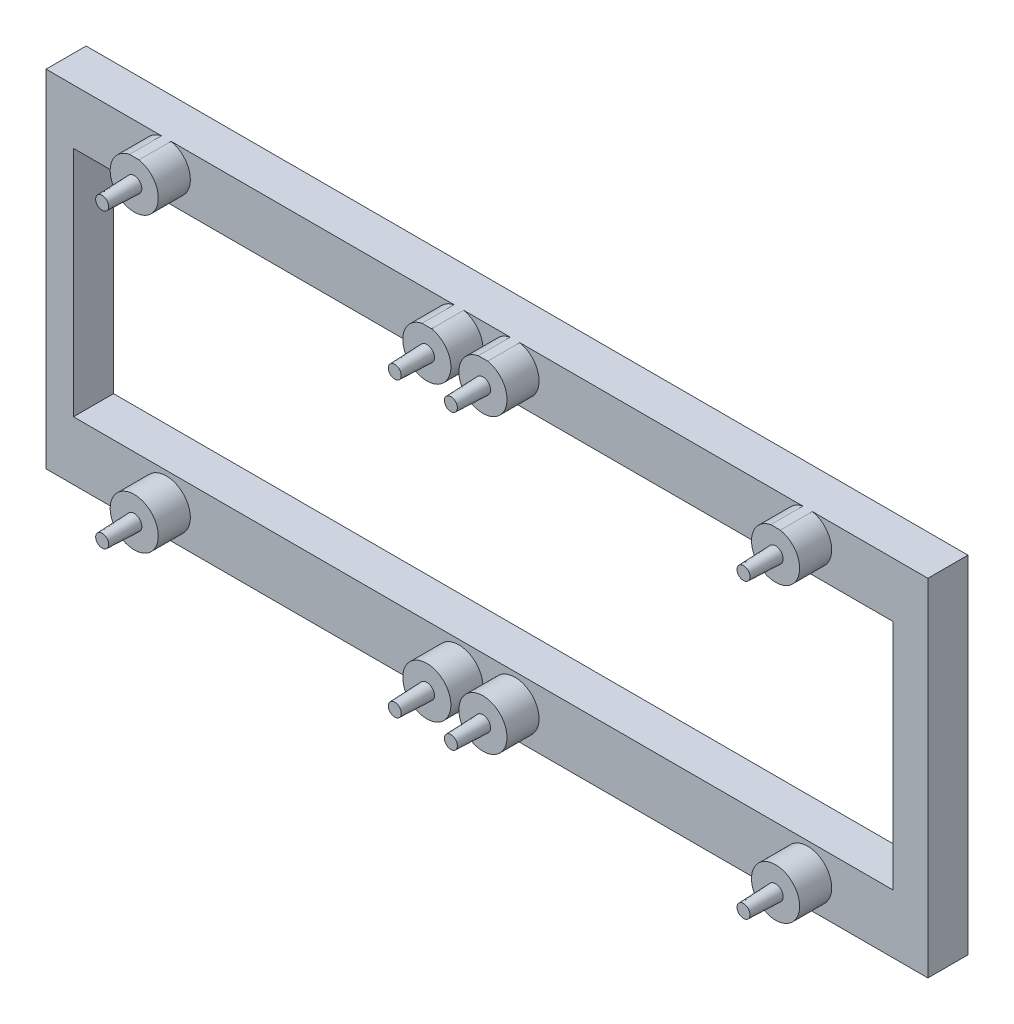
ISO-10303-21;
HEADER;
FILE_DESCRIPTION(('STEP AP214'),'2;1');
FILE_NAME('part.step','',(''),(''),'','','');
FILE_SCHEMA(('AUTOMOTIVE_DESIGN { 1 0 10303 214 1 1 1 1 }'));
ENDSEC;
DATA;
#1=APPLICATION_CONTEXT('core data for automotive mechanical design processes');
#2=APPLICATION_PROTOCOL_DEFINITION('international standard','automotive_design',2000,#1);
#3=PRODUCT_CONTEXT('',#1,'mechanical');
#4=PRODUCT('Part','Part','',(#3));
#5=PRODUCT_RELATED_PRODUCT_CATEGORY('part','',(#4));
#6=PRODUCT_DEFINITION_FORMATION('','',#4);
#7=PRODUCT_DEFINITION_CONTEXT('part definition',#1,'design');
#8=PRODUCT_DEFINITION('design','',#6,#7);
#9=PRODUCT_DEFINITION_SHAPE('','',#8);
#10=(LENGTH_UNIT() NAMED_UNIT(*) SI_UNIT(.MILLI.,.METRE.));
#11=(NAMED_UNIT(*) PLANE_ANGLE_UNIT() SI_UNIT($,.RADIAN.));
#12=(NAMED_UNIT(*) SI_UNIT($,.STERADIAN.) SOLID_ANGLE_UNIT());
#13=UNCERTAINTY_MEASURE_WITH_UNIT(LENGTH_MEASURE(1.E-05),#10,'distance_accuracy_value','');
#14=(GEOMETRIC_REPRESENTATION_CONTEXT(3) GLOBAL_UNCERTAINTY_ASSIGNED_CONTEXT((#13)) GLOBAL_UNIT_ASSIGNED_CONTEXT((#10,
#11,#12)) REPRESENTATION_CONTEXT('',''));
#15=CARTESIAN_POINT('',(0.,0.,0.));
#16=DIRECTION('',(0.,0.,1.));
#17=DIRECTION('',(1.,0.,0.));
#18=AXIS2_PLACEMENT_3D('',#15,#16,#17);
#19=CARTESIAN_POINT('',(0.,0.,5.));
#20=DIRECTION('',(0.,0.,-1.));
#21=DIRECTION('',(-1.,0.,0.));
#22=AXIS2_PLACEMENT_3D('',#19,#20,#21);
#23=PLANE('',#22);
#24=DIRECTION('',(-1.,0.,0.));
#25=VECTOR('',#24,1.);
#26=CARTESIAN_POINT('',(0.,19.0957279658559,5.));
#27=LINE('',#26,#25);
#28=CARTESIAN_POINT('',(50.618039070522,19.0957279658559,5.));
#29=VERTEX_POINT('',#28);
#30=CARTESIAN_POINT('',(-51.5774304934939,19.0957279658559,5.));
#31=VERTEX_POINT('',#30);
#32=EDGE_CURVE('E225',#29,#31,#27,.T.);
#33=ORIENTED_EDGE('',*,*,#32,.T.);
#34=DIRECTION('',(0.,1.,0.));
#35=VECTOR('',#34,1.);
#36=CARTESIAN_POINT('',(-51.5774304934939,0.,5.));
#37=LINE('',#36,#35);
#38=CARTESIAN_POINT('',(-51.5774304934939,48.0963868586223,5.));
#39=VERTEX_POINT('',#38);
#40=EDGE_CURVE('E154',#31,#39,#37,.T.);
#41=ORIENTED_EDGE('',*,*,#40,.T.);
#42=DIRECTION('',(1.,0.,0.));
#43=VECTOR('',#42,1.);
#44=CARTESIAN_POINT('',(0.,48.0963868586223,5.));
#45=LINE('',#44,#43);
#46=CARTESIAN_POINT('',(50.618039070522,48.0963868586223,5.));
#47=VERTEX_POINT('',#46);
#48=EDGE_CURVE('E230',#39,#47,#45,.T.);
#49=ORIENTED_EDGE('',*,*,#48,.T.);
#50=DIRECTION('',(0.,-1.,0.));
#51=VECTOR('',#50,1.);
#52=CARTESIAN_POINT('',(50.618039070522,0.,5.));
#53=LINE('',#52,#51);
#54=EDGE_CURVE('E227',#47,#29,#53,.T.);
#55=ORIENTED_EDGE('',*,*,#54,.T.);
#56=EDGE_LOOP('',(#33,#41,#49,#55));
#57=FACE_BOUND('',#56,.T.);
#58=CARTESIAN_POINT('',(-3.49999999999998,15.5,5.));
#59=DIRECTION('',(0.,0.,-1.));
#60=DIRECTION('',(-1.,0.,0.));
#61=AXIS2_PLACEMENT_3D('',#58,#59,#60);
#62=CIRCLE('',#61,3.);
#63=CARTESIAN_POINT('',(-6.49999999999998,15.5,5.));
#64=VERTEX_POINT('',#63);
#65=EDGE_CURVE('E288',#64,#64,#62,.F.);
#66=ORIENTED_EDGE('',*,*,#65,.F.);
#67=EDGE_LOOP('',(#66));
#68=FACE_BOUND('',#67,.T.);
#69=CARTESIAN_POINT('',(-40.,15.5,5.));
#70=DIRECTION('',(0.,0.,-1.));
#71=DIRECTION('',(-1.,0.,0.));
#72=AXIS2_PLACEMENT_3D('',#69,#70,#71);
#73=CIRCLE('',#72,3.);
#74=CARTESIAN_POINT('',(-43.,15.5,5.));
#75=VERTEX_POINT('',#74);
#76=EDGE_CURVE('E345',#75,#75,#73,.F.);
#77=ORIENTED_EDGE('',*,*,#76,.F.);
#78=EDGE_LOOP('',(#77));
#79=FACE_BOUND('',#78,.T.);
#80=DIRECTION('',(0.,-1.,0.));
#81=VECTOR('',#80,1.);
#82=CARTESIAN_POINT('',(-55.,-85.,5.));
#83=LINE('',#82,#81);
#84=CARTESIAN_POINT('',(-55.,54.9408652156966,5.));
#85=VERTEX_POINT('',#84);
#86=CARTESIAN_POINT('',(-55.,11.7596909610963,5.));
#87=VERTEX_POINT('',#86);
#88=EDGE_CURVE('E319',#85,#87,#83,.T.);
#89=ORIENTED_EDGE('',*,*,#88,.T.);
#90=DIRECTION('',(1.,0.,0.));
#91=VECTOR('',#90,1.);
#92=CARTESIAN_POINT('',(0.,11.7596909610963,5.));
#93=LINE('',#92,#91);
#94=CARTESIAN_POINT('',(55.,11.7596909610963,5.));
#95=VERTEX_POINT('',#94);
#96=EDGE_CURVE('E237',#87,#95,#93,.T.);
#97=ORIENTED_EDGE('',*,*,#96,.T.);
#98=DIRECTION('',(0.,1.,0.));
#99=VECTOR('',#98,1.);
#100=CARTESIAN_POINT('',(55.,-85.,5.));
#101=LINE('',#100,#99);
#102=CARTESIAN_POINT('',(55.,54.9408652156966,5.));
#103=VERTEX_POINT('',#102);
#104=EDGE_CURVE('E316',#95,#103,#101,.T.);
#105=ORIENTED_EDGE('',*,*,#104,.T.);
#106=DIRECTION('',(-1.,0.,0.));
#107=VECTOR('',#106,1.);
#108=CARTESIAN_POINT('',(0.,54.9408652156966,5.));
#109=LINE('',#108,#107);
#110=CARTESIAN_POINT('',(40.5927156005248,54.9408652156966,5.));
#111=VERTEX_POINT('',#110);
#112=EDGE_CURVE('E190',#103,#111,#109,.T.);
#113=ORIENTED_EDGE('',*,*,#112,.T.);
#114=CARTESIAN_POINT('',(40.,52.,5.));
#115=DIRECTION('',(0.,0.,-1.));
#116=DIRECTION('',(-1.,0.,0.));
#117=AXIS2_PLACEMENT_3D('',#114,#115,#116);
#118=CIRCLE('',#117,3.);
#119=CARTESIAN_POINT('',(39.4072843994752,54.9408652156966,5.));
#120=VERTEX_POINT('',#119);
#121=EDGE_CURVE('E333',#120,#111,#118,.F.);
#122=ORIENTED_EDGE('',*,*,#121,.F.);
#123=CARTESIAN_POINT('',(4.09271560052479,54.9408652156966,5.));
#124=VERTEX_POINT('',#123);
#125=EDGE_CURVE('E212',#120,#124,#109,.T.);
#126=ORIENTED_EDGE('',*,*,#125,.T.);
#127=CARTESIAN_POINT('',(3.49999999999998,52.,5.));
#128=DIRECTION('',(0.,0.,-1.));
#129=DIRECTION('',(-1.,0.,0.));
#130=AXIS2_PLACEMENT_3D('',#127,#128,#129);
#131=CIRCLE('',#130,3.);
#132=CARTESIAN_POINT('',(2.90728439947517,54.9408652156966,5.));
#133=VERTEX_POINT('',#132);
#134=EDGE_CURVE('E336',#133,#124,#131,.F.);
#135=ORIENTED_EDGE('',*,*,#134,.F.);
#136=CARTESIAN_POINT('',(-2.90728439947517,54.9408652156966,5.));
#137=VERTEX_POINT('',#136);
#138=EDGE_CURVE('E202',#133,#137,#109,.T.);
#139=ORIENTED_EDGE('',*,*,#138,.T.);
#140=CARTESIAN_POINT('',(-3.49999999999998,52.,5.));
#141=DIRECTION('',(0.,0.,-1.));
#142=DIRECTION('',(-1.,0.,0.));
#143=AXIS2_PLACEMENT_3D('',#140,#141,#142);
#144=CIRCLE('',#143,3.);
#145=CARTESIAN_POINT('',(-4.0927156005248,54.9408652156966,5.));
#146=VERTEX_POINT('',#145);
#147=EDGE_CURVE('E339',#146,#137,#144,.F.);
#148=ORIENTED_EDGE('',*,*,#147,.F.);
#149=CARTESIAN_POINT('',(-39.4072843994752,54.9408652156966,5.));
#150=VERTEX_POINT('',#149);
#151=EDGE_CURVE('E189',#146,#150,#109,.T.);
#152=ORIENTED_EDGE('',*,*,#151,.T.);
#153=CARTESIAN_POINT('',(-40.,52.,5.));
#154=DIRECTION('',(0.,0.,-1.));
#155=DIRECTION('',(-1.,0.,0.));
#156=AXIS2_PLACEMENT_3D('',#153,#154,#155);
#157=CIRCLE('',#156,3.);
#158=CARTESIAN_POINT('',(-40.5927156005248,54.9408652156966,5.));
#159=VERTEX_POINT('',#158);
#160=EDGE_CURVE('E342',#159,#150,#157,.F.);
#161=ORIENTED_EDGE('',*,*,#160,.F.);
#162=EDGE_CURVE('E186',#159,#85,#109,.T.);
#163=ORIENTED_EDGE('',*,*,#162,.T.);
#164=EDGE_LOOP('',(#89,#97,#105,#113,#122,#126,#135,#139,#148,#152,#161,#163));
#165=FACE_BOUND('',#164,.T.);
#166=CARTESIAN_POINT('',(40.,15.5,5.));
#167=DIRECTION('',(0.,0.,-1.));
#168=DIRECTION('',(-1.,0.,0.));
#169=AXIS2_PLACEMENT_3D('',#166,#167,#168);
#170=CIRCLE('',#169,3.);
#171=CARTESIAN_POINT('',(37.,15.5,5.));
#172=VERTEX_POINT('',#171);
#173=EDGE_CURVE('E330',#172,#172,#170,.F.);
#174=ORIENTED_EDGE('',*,*,#173,.F.);
#175=EDGE_LOOP('',(#174));
#176=FACE_BOUND('',#175,.T.);
#177=CARTESIAN_POINT('',(3.49999999999998,15.5,5.));
#178=DIRECTION('',(0.,0.,-1.));
#179=DIRECTION('',(-1.,0.,0.));
#180=AXIS2_PLACEMENT_3D('',#177,#178,#179);
#181=CIRCLE('',#180,3.);
#182=CARTESIAN_POINT('',(0.499999999999981,15.5,5.));
#183=VERTEX_POINT('',#182);
#184=EDGE_CURVE('E323',#183,#183,#181,.F.);
#185=ORIENTED_EDGE('',*,*,#184,.F.);
#186=EDGE_LOOP('',(#185));
#187=FACE_BOUND('',#186,.T.);
#188=ADVANCED_FACE('F36',(#57,#68,#79,#165,#176,#187),#23,.F.);
#189=CARTESIAN_POINT('',(55.,-85.,5.));
#190=DIRECTION('',(-1.,0.,0.));
#191=DIRECTION('',(0.,0.,1.));
#192=AXIS2_PLACEMENT_3D('',#189,#190,#191);
#193=PLANE('',#192);
#194=ORIENTED_EDGE('',*,*,#104,.F.);
#195=DIRECTION('',(0.,0.,-1.));
#196=VECTOR('',#195,1.);
#197=CARTESIAN_POINT('',(55.,11.7596909610963,5.));
#198=LINE('',#197,#196);
#199=CARTESIAN_POINT('',(55.,11.7596909610963,0.));
#200=VERTEX_POINT('',#199);
#201=EDGE_CURVE('E240',#95,#200,#198,.T.);
#202=ORIENTED_EDGE('',*,*,#201,.T.);
#203=DIRECTION('',(0.,1.,0.));
#204=VECTOR('',#203,1.);
#205=CARTESIAN_POINT('',(55.,-85.,0.));
#206=LINE('',#205,#204);
#207=CARTESIAN_POINT('',(55.,54.9408652156966,0.));
#208=VERTEX_POINT('',#207);
#209=EDGE_CURVE('E315',#200,#208,#206,.T.);
#210=ORIENTED_EDGE('',*,*,#209,.T.);
#211=DIRECTION('',(0.,0.,1.));
#212=VECTOR('',#211,1.);
#213=CARTESIAN_POINT('',(55.,54.9408652156966,5.));
#214=LINE('',#213,#212);
#215=EDGE_CURVE('E222',#208,#103,#214,.T.);
#216=ORIENTED_EDGE('',*,*,#215,.T.);
#217=EDGE_LOOP('',(#194,#202,#210,#216));
#218=FACE_BOUND('',#217,.T.);
#219=ADVANCED_FACE('F38',(#218),#193,.F.);
#220=CARTESIAN_POINT('',(-55.,-85.,5.));
#221=DIRECTION('',(1.,0.,0.));
#222=DIRECTION('',(0.,0.,-1.));
#223=AXIS2_PLACEMENT_3D('',#220,#221,#222);
#224=PLANE('',#223);
#225=DIRECTION('',(0.,-1.,0.));
#226=VECTOR('',#225,1.);
#227=CARTESIAN_POINT('',(-55.,-85.,0.));
#228=LINE('',#227,#226);
#229=CARTESIAN_POINT('',(-55.,54.9408652156966,0.));
#230=VERTEX_POINT('',#229);
#231=CARTESIAN_POINT('',(-55.,11.7596909610963,0.));
#232=VERTEX_POINT('',#231);
#233=EDGE_CURVE('E320',#230,#232,#228,.T.);
#234=ORIENTED_EDGE('',*,*,#233,.T.);
#235=DIRECTION('',(0.,0.,1.));
#236=VECTOR('',#235,1.);
#237=CARTESIAN_POINT('',(-55.,11.7596909610963,5.));
#238=LINE('',#237,#236);
#239=EDGE_CURVE('E234',#232,#87,#238,.T.);
#240=ORIENTED_EDGE('',*,*,#239,.T.);
#241=ORIENTED_EDGE('',*,*,#88,.F.);
#242=DIRECTION('',(0.,0.,-1.));
#243=VECTOR('',#242,1.);
#244=CARTESIAN_POINT('',(-55.,54.9408652156966,5.));
#245=LINE('',#244,#243);
#246=EDGE_CURVE('E194',#85,#230,#245,.T.);
#247=ORIENTED_EDGE('',*,*,#246,.T.);
#248=EDGE_LOOP('',(#234,#240,#241,#247));
#249=FACE_BOUND('',#248,.T.);
#250=ADVANCED_FACE('F377',(#249),#224,.F.);
#251=CARTESIAN_POINT('',(0.,0.,0.));
#252=DIRECTION('',(0.,0.,-1.));
#253=DIRECTION('',(-1.,0.,0.));
#254=AXIS2_PLACEMENT_3D('',#251,#252,#253);
#255=PLANE('',#254);
#256=DIRECTION('',(-1.,0.,0.));
#257=VECTOR('',#256,1.);
#258=CARTESIAN_POINT('',(-72.024121137128,11.7596909610963,0.));
#259=LINE('',#258,#257);
#260=EDGE_CURVE('E183',#200,#232,#259,.T.);
#261=ORIENTED_EDGE('',*,*,#260,.T.);
#262=ORIENTED_EDGE('',*,*,#233,.F.);
#263=DIRECTION('',(1.,0.,0.));
#264=VECTOR('',#263,1.);
#265=CARTESIAN_POINT('',(-72.024121137128,54.9408652156966,0.));
#266=LINE('',#265,#264);
#267=EDGE_CURVE('E168',#230,#208,#266,.T.);
#268=ORIENTED_EDGE('',*,*,#267,.T.);
#269=ORIENTED_EDGE('',*,*,#209,.F.);
#270=EDGE_LOOP('',(#261,#262,#268,#269));
#271=FACE_BOUND('',#270,.T.);
#272=DIRECTION('',(0.,-1.,0.));
#273=VECTOR('',#272,1.);
#274=CARTESIAN_POINT('',(-51.5774304934939,48.0963868586223,0.));
#275=LINE('',#274,#273);
#276=CARTESIAN_POINT('',(-51.5774304934939,48.0963868586223,0.));
#277=VERTEX_POINT('',#276);
#278=CARTESIAN_POINT('',(-51.5774304934939,19.0957279658559,0.));
#279=VERTEX_POINT('',#278);
#280=EDGE_CURVE('E151',#277,#279,#275,.T.);
#281=ORIENTED_EDGE('',*,*,#280,.T.);
#282=DIRECTION('',(1.,0.,0.));
#283=VECTOR('',#282,1.);
#284=CARTESIAN_POINT('',(-51.5774304934939,19.0957279658559,0.));
#285=LINE('',#284,#283);
#286=CARTESIAN_POINT('',(50.618039070522,19.0957279658559,0.));
#287=VERTEX_POINT('',#286);
#288=EDGE_CURVE('E160',#279,#287,#285,.T.);
#289=ORIENTED_EDGE('',*,*,#288,.T.);
#290=DIRECTION('',(0.,1.,0.));
#291=VECTOR('',#290,1.);
#292=CARTESIAN_POINT('',(50.618039070522,48.0963868586223,0.));
#293=LINE('',#292,#291);
#294=CARTESIAN_POINT('',(50.618039070522,48.0963868586223,0.));
#295=VERTEX_POINT('',#294);
#296=EDGE_CURVE('E59',#287,#295,#293,.T.);
#297=ORIENTED_EDGE('',*,*,#296,.T.);
#298=DIRECTION('',(-1.,0.,0.));
#299=VECTOR('',#298,1.);
#300=CARTESIAN_POINT('',(-51.5774304934939,48.0963868586223,0.));
#301=LINE('',#300,#299);
#302=EDGE_CURVE('E157',#295,#277,#301,.T.);
#303=ORIENTED_EDGE('',*,*,#302,.T.);
#304=EDGE_LOOP('',(#281,#289,#297,#303));
#305=FACE_BOUND('',#304,.T.);
#306=ADVANCED_FACE('F164',(#271,#305),#255,.T.);
#307=CARTESIAN_POINT('',(3.49999999999998,15.5,9.));
#308=DIRECTION('',(0.,0.,-1.));
#309=DIRECTION('',(-1.,0.,0.));
#310=AXIS2_PLACEMENT_3D('',#307,#308,#309);
#311=CYLINDRICAL_SURFACE('',#310,3.);
#312=CARTESIAN_POINT('',(3.49999999999998,15.5,9.));
#313=DIRECTION('',(0.,0.,1.));
#314=DIRECTION('',(-1.,0.,0.));
#315=AXIS2_PLACEMENT_3D('',#312,#313,#314);
#316=CIRCLE('',#315,3.);
#317=CARTESIAN_POINT('',(0.499999999999981,15.5,9.));
#318=VERTEX_POINT('',#317);
#319=EDGE_CURVE('E312',#318,#318,#316,.T.);
#320=ORIENTED_EDGE('',*,*,#319,.F.);
#321=EDGE_LOOP('',(#320));
#322=FACE_BOUND('',#321,.T.);
#323=ORIENTED_EDGE('',*,*,#184,.T.);
#324=EDGE_LOOP('',(#323));
#325=FACE_BOUND('',#324,.T.);
#326=ADVANCED_FACE('F364',(#322,#325),#311,.T.);
#327=CARTESIAN_POINT('',(3.49999999999998,15.5,9.));
#328=DIRECTION('',(0.,0.,-1.));
#329=DIRECTION('',(-1.,0.,0.));
#330=AXIS2_PLACEMENT_3D('',#327,#328,#329);
#331=PLANE('',#330);
#332=CARTESIAN_POINT('',(3.49999999999998,15.5,9.));
#333=DIRECTION('',(0.,0.,1.));
#334=DIRECTION('',(1.,0.,0.));
#335=AXIS2_PLACEMENT_3D('',#332,#333,#334);
#336=CIRCLE('',#335,0.95);
#337=CARTESIAN_POINT('',(4.44999999999998,15.5,9.));
#338=VERTEX_POINT('',#337);
#339=EDGE_CURVE('E264',#338,#338,#336,.T.);
#340=ORIENTED_EDGE('',*,*,#339,.F.);
#341=EDGE_LOOP('',(#340));
#342=FACE_BOUND('',#341,.T.);
#343=ORIENTED_EDGE('',*,*,#319,.T.);
#344=EDGE_LOOP('',(#343));
#345=FACE_BOUND('',#344,.T.);
#346=ADVANCED_FACE('F366',(#342,#345),#331,.F.);
#347=CARTESIAN_POINT('',(40.,15.5,9.));
#348=DIRECTION('',(0.,0.,-1.));
#349=DIRECTION('',(-1.,0.,0.));
#350=AXIS2_PLACEMENT_3D('',#347,#348,#349);
#351=CYLINDRICAL_SURFACE('',#350,3.);
#352=CARTESIAN_POINT('',(40.,15.5,9.));
#353=DIRECTION('',(0.,0.,1.));
#354=DIRECTION('',(-1.,0.,0.));
#355=AXIS2_PLACEMENT_3D('',#352,#353,#354);
#356=CIRCLE('',#355,3.);
#357=CARTESIAN_POINT('',(37.,15.5,9.));
#358=VERTEX_POINT('',#357);
#359=EDGE_CURVE('E309',#358,#358,#356,.T.);
#360=ORIENTED_EDGE('',*,*,#359,.F.);
#361=EDGE_LOOP('',(#360));
#362=FACE_BOUND('',#361,.T.);
#363=ORIENTED_EDGE('',*,*,#173,.T.);
#364=EDGE_LOOP('',(#363));
#365=FACE_BOUND('',#364,.T.);
#366=ADVANCED_FACE('F373',(#362,#365),#351,.T.);
#367=CARTESIAN_POINT('',(40.,15.5,9.));
#368=DIRECTION('',(0.,0.,-1.));
#369=DIRECTION('',(-1.,0.,0.));
#370=AXIS2_PLACEMENT_3D('',#367,#368,#369);
#371=PLANE('',#370);
#372=CARTESIAN_POINT('',(40.,15.5,9.));
#373=DIRECTION('',(0.,0.,1.));
#374=DIRECTION('',(1.,0.,0.));
#375=AXIS2_PLACEMENT_3D('',#372,#373,#374);
#376=CIRCLE('',#375,0.950000000000001);
#377=CARTESIAN_POINT('',(40.95,15.5,9.));
#378=VERTEX_POINT('',#377);
#379=EDGE_CURVE('E258',#378,#378,#376,.T.);
#380=ORIENTED_EDGE('',*,*,#379,.F.);
#381=EDGE_LOOP('',(#380));
#382=FACE_BOUND('',#381,.T.);
#383=ORIENTED_EDGE('',*,*,#359,.T.);
#384=EDGE_LOOP('',(#383));
#385=FACE_BOUND('',#384,.T.);
#386=ADVANCED_FACE('F416',(#382,#385),#371,.F.);
#387=CARTESIAN_POINT('',(40.,52.,9.));
#388=DIRECTION('',(0.,0.,-1.));
#389=DIRECTION('',(-1.,0.,0.));
#390=AXIS2_PLACEMENT_3D('',#387,#388,#389);
#391=CYLINDRICAL_SURFACE('',#390,3.);
#392=CARTESIAN_POINT('',(40.,52.,9.));
#393=DIRECTION('',(0.,0.,1.));
#394=DIRECTION('',(-1.,0.,0.));
#395=AXIS2_PLACEMENT_3D('',#392,#393,#394);
#396=CIRCLE('',#395,3.);
#397=CARTESIAN_POINT('',(39.4072843994752,54.9408652156966,9.));
#398=VERTEX_POINT('',#397);
#399=CARTESIAN_POINT('',(40.5927156005248,54.9408652156966,9.));
#400=VERTEX_POINT('',#399);
#401=EDGE_CURVE('E306',#398,#400,#396,.T.);
#402=ORIENTED_EDGE('',*,*,#401,.F.);
#403=DIRECTION('',(0.,0.,-1.));
#404=VECTOR('',#403,1.);
#405=CARTESIAN_POINT('',(39.4072843994752,54.9408652156966,9.));
#406=LINE('',#405,#404);
#407=EDGE_CURVE('E213',#398,#120,#406,.T.);
#408=ORIENTED_EDGE('',*,*,#407,.T.);
#409=ORIENTED_EDGE('',*,*,#121,.T.);
#410=DIRECTION('',(0.,0.,-1.));
#411=VECTOR('',#410,1.);
#412=CARTESIAN_POINT('',(40.5927156005248,54.9408652156966,9.));
#413=LINE('',#412,#411);
#414=EDGE_CURVE('E219',#111,#400,#413,.F.);
#415=ORIENTED_EDGE('',*,*,#414,.T.);
#416=EDGE_LOOP('',(#402,#408,#409,#415));
#417=FACE_BOUND('',#416,.T.);
#418=ADVANCED_FACE('F401',(#417),#391,.T.);
#419=CARTESIAN_POINT('',(40.,52.,9.));
#420=DIRECTION('',(0.,0.,-1.));
#421=DIRECTION('',(-1.,0.,0.));
#422=AXIS2_PLACEMENT_3D('',#419,#420,#421);
#423=PLANE('',#422);
#424=CARTESIAN_POINT('',(40.,52.,9.));
#425=DIRECTION('',(0.,0.,1.));
#426=DIRECTION('',(1.,0.,0.));
#427=AXIS2_PLACEMENT_3D('',#424,#425,#426);
#428=CIRCLE('',#427,0.950000000000001);
#429=CARTESIAN_POINT('',(40.95,52.,9.));
#430=VERTEX_POINT('',#429);
#431=EDGE_CURVE('E252',#430,#430,#428,.T.);
#432=ORIENTED_EDGE('',*,*,#431,.F.);
#433=EDGE_LOOP('',(#432));
#434=FACE_BOUND('',#433,.T.);
#435=ORIENTED_EDGE('',*,*,#401,.T.);
#436=DIRECTION('',(-1.,0.,0.));
#437=VECTOR('',#436,1.);
#438=CARTESIAN_POINT('',(40.,54.9408652156966,9.));
#439=LINE('',#438,#437);
#440=EDGE_CURVE('E216',#400,#398,#439,.T.);
#441=ORIENTED_EDGE('',*,*,#440,.T.);
#442=EDGE_LOOP('',(#435,#441));
#443=FACE_BOUND('',#442,.T.);
#444=ADVANCED_FACE('F404',(#434,#443),#423,.F.);
#445=CARTESIAN_POINT('',(3.49999999999998,52.,9.));
#446=DIRECTION('',(0.,0.,-1.));
#447=DIRECTION('',(-1.,0.,0.));
#448=AXIS2_PLACEMENT_3D('',#445,#446,#447);
#449=CYLINDRICAL_SURFACE('',#448,3.);
#450=CARTESIAN_POINT('',(3.49999999999998,52.,9.));
#451=DIRECTION('',(0.,0.,1.));
#452=DIRECTION('',(-1.,0.,0.));
#453=AXIS2_PLACEMENT_3D('',#450,#451,#452);
#454=CIRCLE('',#453,3.);
#455=CARTESIAN_POINT('',(2.90728439947517,54.9408652156966,9.));
#456=VERTEX_POINT('',#455);
#457=CARTESIAN_POINT('',(4.09271560052479,54.9408652156966,9.));
#458=VERTEX_POINT('',#457);
#459=EDGE_CURVE('E303',#456,#458,#454,.T.);
#460=ORIENTED_EDGE('',*,*,#459,.F.);
#461=DIRECTION('',(0.,0.,-1.));
#462=VECTOR('',#461,1.);
#463=CARTESIAN_POINT('',(2.90728439947517,54.9408652156966,9.));
#464=LINE('',#463,#462);
#465=EDGE_CURVE('E203',#456,#133,#464,.T.);
#466=ORIENTED_EDGE('',*,*,#465,.T.);
#467=ORIENTED_EDGE('',*,*,#134,.T.);
#468=DIRECTION('',(0.,0.,-1.));
#469=VECTOR('',#468,1.);
#470=CARTESIAN_POINT('',(4.09271560052479,54.9408652156966,9.));
#471=LINE('',#470,#469);
#472=EDGE_CURVE('E209',#124,#458,#471,.F.);
#473=ORIENTED_EDGE('',*,*,#472,.T.);
#474=EDGE_LOOP('',(#460,#466,#467,#473));
#475=FACE_BOUND('',#474,.T.);
#476=ADVANCED_FACE('F406',(#475),#449,.T.);
#477=CARTESIAN_POINT('',(3.49999999999998,52.,9.));
#478=DIRECTION('',(0.,0.,-1.));
#479=DIRECTION('',(-1.,0.,0.));
#480=AXIS2_PLACEMENT_3D('',#477,#478,#479);
#481=PLANE('',#480);
#482=CARTESIAN_POINT('',(3.49999999999998,52.,9.));
#483=DIRECTION('',(0.,0.,1.));
#484=DIRECTION('',(1.,0.,0.));
#485=AXIS2_PLACEMENT_3D('',#482,#483,#484);
#486=CIRCLE('',#485,0.95);
#487=CARTESIAN_POINT('',(4.44999999999998,52.,9.));
#488=VERTEX_POINT('',#487);
#489=EDGE_CURVE('E246',#488,#488,#486,.T.);
#490=ORIENTED_EDGE('',*,*,#489,.F.);
#491=EDGE_LOOP('',(#490));
#492=FACE_BOUND('',#491,.T.);
#493=ORIENTED_EDGE('',*,*,#459,.T.);
#494=DIRECTION('',(-1.,0.,0.));
#495=VECTOR('',#494,1.);
#496=CARTESIAN_POINT('',(3.49999999999998,54.9408652156966,9.));
#497=LINE('',#496,#495);
#498=EDGE_CURVE('E206',#458,#456,#497,.T.);
#499=ORIENTED_EDGE('',*,*,#498,.T.);
#500=EDGE_LOOP('',(#493,#499));
#501=FACE_BOUND('',#500,.T.);
#502=ADVANCED_FACE('F413',(#492,#501),#481,.F.);
#503=CARTESIAN_POINT('',(-3.49999999999998,52.,9.));
#504=DIRECTION('',(0.,0.,-1.));
#505=DIRECTION('',(-1.,0.,0.));
#506=AXIS2_PLACEMENT_3D('',#503,#504,#505);
#507=CYLINDRICAL_SURFACE('',#506,3.);
#508=CARTESIAN_POINT('',(-3.49999999999998,52.,9.));
#509=DIRECTION('',(0.,0.,1.));
#510=DIRECTION('',(1.,0.,0.));
#511=AXIS2_PLACEMENT_3D('',#508,#509,#510);
#512=CIRCLE('',#511,3.);
#513=CARTESIAN_POINT('',(-4.0927156005248,54.9408652156966,9.));
#514=VERTEX_POINT('',#513);
#515=CARTESIAN_POINT('',(-2.90728439947517,54.9408652156966,9.));
#516=VERTEX_POINT('',#515);
#517=EDGE_CURVE('E300',#514,#516,#512,.T.);
#518=ORIENTED_EDGE('',*,*,#517,.F.);
#519=DIRECTION('',(0.,0.,-1.));
#520=VECTOR('',#519,1.);
#521=CARTESIAN_POINT('',(-4.0927156005248,54.9408652156966,9.));
#522=LINE('',#521,#520);
#523=EDGE_CURVE('E191',#514,#146,#522,.T.);
#524=ORIENTED_EDGE('',*,*,#523,.T.);
#525=ORIENTED_EDGE('',*,*,#147,.T.);
#526=DIRECTION('',(0.,0.,-1.));
#527=VECTOR('',#526,1.);
#528=CARTESIAN_POINT('',(-2.90728439947517,54.9408652156966,9.));
#529=LINE('',#528,#527);
#530=EDGE_CURVE('E199',#137,#516,#529,.F.);
#531=ORIENTED_EDGE('',*,*,#530,.T.);
#532=EDGE_LOOP('',(#518,#524,#525,#531));
#533=FACE_BOUND('',#532,.T.);
#534=ADVANCED_FACE('F461',(#533),#507,.T.);
#535=CARTESIAN_POINT('',(-3.49999999999998,52.,9.));
#536=DIRECTION('',(0.,0.,1.));
#537=DIRECTION('',(1.,0.,0.));
#538=AXIS2_PLACEMENT_3D('',#535,#536,#537);
#539=PLANE('',#538);
#540=DIRECTION('',(1.,0.,0.));
#541=VECTOR('',#540,1.);
#542=CARTESIAN_POINT('',(-3.49999999999998,54.9408652156966,9.));
#543=LINE('',#542,#541);
#544=EDGE_CURVE('E197',#514,#516,#543,.T.);
#545=ORIENTED_EDGE('',*,*,#544,.F.);
#546=ORIENTED_EDGE('',*,*,#517,.T.);
#547=EDGE_LOOP('',(#545,#546));
#548=FACE_BOUND('',#547,.T.);
#549=CARTESIAN_POINT('',(-3.49999999999998,52.,9.));
#550=DIRECTION('',(0.,0.,1.));
#551=DIRECTION('',(1.,0.,0.));
#552=AXIS2_PLACEMENT_3D('',#549,#550,#551);
#553=CIRCLE('',#552,0.95);
#554=CARTESIAN_POINT('',(-2.54999999999998,52.,9.));
#555=VERTEX_POINT('',#554);
#556=EDGE_CURVE('E44',#555,#555,#553,.T.);
#557=ORIENTED_EDGE('',*,*,#556,.F.);
#558=EDGE_LOOP('',(#557));
#559=FACE_BOUND('',#558,.T.);
#560=ADVANCED_FACE('F470',(#548,#559),#539,.T.);
#561=CARTESIAN_POINT('',(-40.,52.,9.));
#562=DIRECTION('',(0.,0.,-1.));
#563=DIRECTION('',(-1.,0.,0.));
#564=AXIS2_PLACEMENT_3D('',#561,#562,#563);
#565=CYLINDRICAL_SURFACE('',#564,3.);
#566=CARTESIAN_POINT('',(-40.,52.,9.));
#567=DIRECTION('',(0.,0.,1.));
#568=DIRECTION('',(1.,0.,0.));
#569=AXIS2_PLACEMENT_3D('',#566,#567,#568);
#570=CIRCLE('',#569,3.);
#571=CARTESIAN_POINT('',(-40.5927156005248,54.9408652156966,9.));
#572=VERTEX_POINT('',#571);
#573=CARTESIAN_POINT('',(-39.4072843994752,54.9408652156966,9.));
#574=VERTEX_POINT('',#573);
#575=EDGE_CURVE('E297',#572,#574,#570,.T.);
#576=ORIENTED_EDGE('',*,*,#575,.F.);
#577=DIRECTION('',(0.,0.,-1.));
#578=VECTOR('',#577,1.);
#579=CARTESIAN_POINT('',(-40.5927156005248,54.9408652156966,9.));
#580=LINE('',#579,#578);
#581=EDGE_CURVE('E182',#572,#159,#580,.T.);
#582=ORIENTED_EDGE('',*,*,#581,.T.);
#583=ORIENTED_EDGE('',*,*,#160,.T.);
#584=DIRECTION('',(0.,0.,-1.));
#585=VECTOR('',#584,1.);
#586=CARTESIAN_POINT('',(-39.4072843994752,54.9408652156966,9.));
#587=LINE('',#586,#585);
#588=EDGE_CURVE('E179',#150,#574,#587,.F.);
#589=ORIENTED_EDGE('',*,*,#588,.T.);
#590=EDGE_LOOP('',(#576,#582,#583,#589));
#591=FACE_BOUND('',#590,.T.);
#592=ADVANCED_FACE('F480',(#591),#565,.T.);
#593=CARTESIAN_POINT('',(-40.,52.,9.));
#594=DIRECTION('',(0.,0.,1.));
#595=DIRECTION('',(1.,0.,0.));
#596=AXIS2_PLACEMENT_3D('',#593,#594,#595);
#597=PLANE('',#596);
#598=DIRECTION('',(1.,0.,0.));
#599=VECTOR('',#598,1.);
#600=CARTESIAN_POINT('',(-40.,54.9408652156966,9.));
#601=LINE('',#600,#599);
#602=EDGE_CURVE('E11',#572,#574,#601,.T.);
#603=ORIENTED_EDGE('',*,*,#602,.F.);
#604=ORIENTED_EDGE('',*,*,#575,.T.);
#605=EDGE_LOOP('',(#603,#604));
#606=FACE_BOUND('',#605,.T.);
#607=CARTESIAN_POINT('',(-40.,52.,9.));
#608=DIRECTION('',(0.,0.,1.));
#609=DIRECTION('',(1.,0.,0.));
#610=AXIS2_PLACEMENT_3D('',#607,#608,#609);
#611=CIRCLE('',#610,0.950000000000001);
#612=CARTESIAN_POINT('',(-39.05,52.,9.));
#613=VERTEX_POINT('',#612);
#614=EDGE_CURVE('E282',#613,#613,#611,.T.);
#615=ORIENTED_EDGE('',*,*,#614,.F.);
#616=EDGE_LOOP('',(#615));
#617=FACE_BOUND('',#616,.T.);
#618=ADVANCED_FACE('F490',(#606,#617),#597,.T.);
#619=CARTESIAN_POINT('',(-40.,15.5,9.));
#620=DIRECTION('',(0.,0.,-1.));
#621=DIRECTION('',(-1.,0.,0.));
#622=AXIS2_PLACEMENT_3D('',#619,#620,#621);
#623=CYLINDRICAL_SURFACE('',#622,3.);
#624=CARTESIAN_POINT('',(-40.,15.5,9.));
#625=DIRECTION('',(0.,0.,1.));
#626=DIRECTION('',(1.,0.,0.));
#627=AXIS2_PLACEMENT_3D('',#624,#625,#626);
#628=CIRCLE('',#627,3.);
#629=CARTESIAN_POINT('',(-37.,15.5,9.));
#630=VERTEX_POINT('',#629);
#631=EDGE_CURVE('E294',#630,#630,#628,.T.);
#632=ORIENTED_EDGE('',*,*,#631,.F.);
#633=EDGE_LOOP('',(#632));
#634=FACE_BOUND('',#633,.T.);
#635=ORIENTED_EDGE('',*,*,#76,.T.);
#636=EDGE_LOOP('',(#635));
#637=FACE_BOUND('',#636,.T.);
#638=ADVANCED_FACE('F500',(#634,#637),#623,.T.);
#639=CARTESIAN_POINT('',(-40.,15.5,9.));
#640=DIRECTION('',(0.,0.,1.));
#641=DIRECTION('',(1.,0.,0.));
#642=AXIS2_PLACEMENT_3D('',#639,#640,#641);
#643=PLANE('',#642);
#644=CARTESIAN_POINT('',(-40.,15.5,9.));
#645=DIRECTION('',(0.,0.,1.));
#646=DIRECTION('',(1.,0.,0.));
#647=AXIS2_PLACEMENT_3D('',#644,#645,#646);
#648=CIRCLE('',#647,0.950000000000001);
#649=CARTESIAN_POINT('',(-39.05,15.5,9.));
#650=VERTEX_POINT('',#649);
#651=EDGE_CURVE('E276',#650,#650,#648,.T.);
#652=ORIENTED_EDGE('',*,*,#651,.F.);
#653=EDGE_LOOP('',(#652));
#654=FACE_BOUND('',#653,.T.);
#655=ORIENTED_EDGE('',*,*,#631,.T.);
#656=EDGE_LOOP('',(#655));
#657=FACE_BOUND('',#656,.T.);
#658=ADVANCED_FACE('F510',(#654,#657),#643,.T.);
#659=CARTESIAN_POINT('',(-3.49999999999998,15.5,9.));
#660=DIRECTION('',(0.,0.,-1.));
#661=DIRECTION('',(-1.,0.,0.));
#662=AXIS2_PLACEMENT_3D('',#659,#660,#661);
#663=CYLINDRICAL_SURFACE('',#662,3.);
#664=CARTESIAN_POINT('',(-3.49999999999998,15.5,9.));
#665=DIRECTION('',(0.,0.,1.));
#666=DIRECTION('',(1.,0.,0.));
#667=AXIS2_PLACEMENT_3D('',#664,#665,#666);
#668=CIRCLE('',#667,3.);
#669=CARTESIAN_POINT('',(-0.499999999999981,15.5,9.));
#670=VERTEX_POINT('',#669);
#671=EDGE_CURVE('E291',#670,#670,#668,.T.);
#672=ORIENTED_EDGE('',*,*,#671,.F.);
#673=EDGE_LOOP('',(#672));
#674=FACE_BOUND('',#673,.T.);
#675=ORIENTED_EDGE('',*,*,#65,.T.);
#676=EDGE_LOOP('',(#675));
#677=FACE_BOUND('',#676,.T.);
#678=ADVANCED_FACE('F350',(#674,#677),#663,.T.);
#679=CARTESIAN_POINT('',(-3.49999999999998,15.5,9.));
#680=DIRECTION('',(0.,0.,1.));
#681=DIRECTION('',(1.,0.,0.));
#682=AXIS2_PLACEMENT_3D('',#679,#680,#681);
#683=PLANE('',#682);
#684=CARTESIAN_POINT('',(-3.49999999999998,15.5,9.));
#685=DIRECTION('',(0.,0.,1.));
#686=DIRECTION('',(1.,0.,0.));
#687=AXIS2_PLACEMENT_3D('',#684,#685,#686);
#688=CIRCLE('',#687,0.95);
#689=CARTESIAN_POINT('',(-2.54999999999998,15.5,9.));
#690=VERTEX_POINT('',#689);
#691=EDGE_CURVE('E270',#690,#690,#688,.T.);
#692=ORIENTED_EDGE('',*,*,#691,.F.);
#693=EDGE_LOOP('',(#692));
#694=FACE_BOUND('',#693,.T.);
#695=ORIENTED_EDGE('',*,*,#671,.T.);
#696=EDGE_LOOP('',(#695));
#697=FACE_BOUND('',#696,.T.);
#698=ADVANCED_FACE('F524',(#694,#697),#683,.T.);
#699=CARTESIAN_POINT('',(-40.,52.,9.));
#700=DIRECTION('',(0.,0.,-1.));
#701=DIRECTION('',(1.,0.,0.));
#702=AXIS2_PLACEMENT_3D('',#699,#700,#701);
#703=CONICAL_SURFACE('',#702,0.950000000000001,0.0349065850398867);
#704=CARTESIAN_POINT('',(-40.,52.,13.));
#705=DIRECTION('',(0.,0.,1.));
#706=DIRECTION('',(1.,0.,0.));
#707=AXIS2_PLACEMENT_3D('',#704,#705,#706);
#708=CIRCLE('',#707,0.810316922033009);
#709=CARTESIAN_POINT('',(-39.189683077967,52.,13.));
#710=VERTEX_POINT('',#709);
#711=EDGE_CURVE('E285',#710,#710,#708,.T.);
#712=ORIENTED_EDGE('',*,*,#711,.F.);
#713=EDGE_LOOP('',(#712));
#714=FACE_BOUND('',#713,.T.);
#715=ORIENTED_EDGE('',*,*,#614,.T.);
#716=EDGE_LOOP('',(#715));
#717=FACE_BOUND('',#716,.T.);
#718=ADVANCED_FACE('F531',(#714,#717),#703,.T.);
#719=CARTESIAN_POINT('',(-40.,52.,13.));
#720=DIRECTION('',(0.,0.,1.));
#721=DIRECTION('',(1.,0.,0.));
#722=AXIS2_PLACEMENT_3D('',#719,#720,#721);
#723=PLANE('',#722);
#724=ORIENTED_EDGE('',*,*,#711,.T.);
#725=EDGE_LOOP('',(#724));
#726=FACE_BOUND('',#725,.T.);
#727=ADVANCED_FACE('F539',(#726),#723,.T.);
#728=CARTESIAN_POINT('',(-40.,15.5,9.));
#729=DIRECTION('',(0.,0.,-1.));
#730=DIRECTION('',(1.,0.,0.));
#731=AXIS2_PLACEMENT_3D('',#728,#729,#730);
#732=CONICAL_SURFACE('',#731,0.950000000000001,0.0349065850398867);
#733=CARTESIAN_POINT('',(-40.,15.5,13.));
#734=DIRECTION('',(0.,0.,1.));
#735=DIRECTION('',(1.,0.,0.));
#736=AXIS2_PLACEMENT_3D('',#733,#734,#735);
#737=CIRCLE('',#736,0.810316922033009);
#738=CARTESIAN_POINT('',(-39.189683077967,15.5,13.));
#739=VERTEX_POINT('',#738);
#740=EDGE_CURVE('E279',#739,#739,#737,.T.);
#741=ORIENTED_EDGE('',*,*,#740,.F.);
#742=EDGE_LOOP('',(#741));
#743=FACE_BOUND('',#742,.T.);
#744=ORIENTED_EDGE('',*,*,#651,.T.);
#745=EDGE_LOOP('',(#744));
#746=FACE_BOUND('',#745,.T.);
#747=ADVANCED_FACE('F547',(#743,#746),#732,.T.);
#748=CARTESIAN_POINT('',(-40.,15.5,13.));
#749=DIRECTION('',(0.,0.,1.));
#750=DIRECTION('',(1.,0.,0.));
#751=AXIS2_PLACEMENT_3D('',#748,#749,#750);
#752=PLANE('',#751);
#753=ORIENTED_EDGE('',*,*,#740,.T.);
#754=EDGE_LOOP('',(#753));
#755=FACE_BOUND('',#754,.T.);
#756=ADVANCED_FACE('F555',(#755),#752,.T.);
#757=CARTESIAN_POINT('',(-3.49999999999998,15.5,9.));
#758=DIRECTION('',(0.,0.,-1.));
#759=DIRECTION('',(1.,0.,0.));
#760=AXIS2_PLACEMENT_3D('',#757,#758,#759);
#761=CONICAL_SURFACE('',#760,0.95,0.0349065850398867);
#762=CARTESIAN_POINT('',(-3.49999999999998,15.5,13.));
#763=DIRECTION('',(0.,0.,1.));
#764=DIRECTION('',(1.,0.,0.));
#765=AXIS2_PLACEMENT_3D('',#762,#763,#764);
#766=CIRCLE('',#765,0.810316922033009);
#767=CARTESIAN_POINT('',(-2.68968307796697,15.5,13.));
#768=VERTEX_POINT('',#767);
#769=EDGE_CURVE('E273',#768,#768,#766,.T.);
#770=ORIENTED_EDGE('',*,*,#769,.F.);
#771=EDGE_LOOP('',(#770));
#772=FACE_BOUND('',#771,.T.);
#773=ORIENTED_EDGE('',*,*,#691,.T.);
#774=EDGE_LOOP('',(#773));
#775=FACE_BOUND('',#774,.T.);
#776=ADVANCED_FACE('F563',(#772,#775),#761,.T.);
#777=CARTESIAN_POINT('',(-3.49999999999998,15.5,13.));
#778=DIRECTION('',(0.,0.,1.));
#779=DIRECTION('',(1.,0.,0.));
#780=AXIS2_PLACEMENT_3D('',#777,#778,#779);
#781=PLANE('',#780);
#782=ORIENTED_EDGE('',*,*,#769,.T.);
#783=EDGE_LOOP('',(#782));
#784=FACE_BOUND('',#783,.T.);
#785=ADVANCED_FACE('F571',(#784),#781,.T.);
#786=CARTESIAN_POINT('',(3.49999999999998,15.5,9.));
#787=DIRECTION('',(0.,0.,-1.));
#788=DIRECTION('',(1.,0.,0.));
#789=AXIS2_PLACEMENT_3D('',#786,#787,#788);
#790=CONICAL_SURFACE('',#789,0.95,0.0349065850398867);
#791=CARTESIAN_POINT('',(3.49999999999998,15.5,13.));
#792=DIRECTION('',(0.,0.,1.));
#793=DIRECTION('',(1.,0.,0.));
#794=AXIS2_PLACEMENT_3D('',#791,#792,#793);
#795=CIRCLE('',#794,0.810316922033009);
#796=CARTESIAN_POINT('',(4.31031692203299,15.5,13.));
#797=VERTEX_POINT('',#796);
#798=EDGE_CURVE('E267',#797,#797,#795,.T.);
#799=ORIENTED_EDGE('',*,*,#798,.F.);
#800=EDGE_LOOP('',(#799));
#801=FACE_BOUND('',#800,.T.);
#802=ORIENTED_EDGE('',*,*,#339,.T.);
#803=EDGE_LOOP('',(#802));
#804=FACE_BOUND('',#803,.T.);
#805=ADVANCED_FACE('F579',(#801,#804),#790,.T.);
#806=CARTESIAN_POINT('',(3.49999999999998,15.5,13.));
#807=DIRECTION('',(0.,0.,1.));
#808=DIRECTION('',(1.,0.,0.));
#809=AXIS2_PLACEMENT_3D('',#806,#807,#808);
#810=PLANE('',#809);
#811=ORIENTED_EDGE('',*,*,#798,.T.);
#812=EDGE_LOOP('',(#811));
#813=FACE_BOUND('',#812,.T.);
#814=ADVANCED_FACE('F587',(#813),#810,.T.);
#815=CARTESIAN_POINT('',(40.,15.5,9.));
#816=DIRECTION('',(0.,0.,-1.));
#817=DIRECTION('',(1.,0.,0.));
#818=AXIS2_PLACEMENT_3D('',#815,#816,#817);
#819=CONICAL_SURFACE('',#818,0.950000000000001,0.0349065850398867);
#820=CARTESIAN_POINT('',(40.,15.5,13.));
#821=DIRECTION('',(0.,0.,1.));
#822=DIRECTION('',(1.,0.,0.));
#823=AXIS2_PLACEMENT_3D('',#820,#821,#822);
#824=CIRCLE('',#823,0.810316922033009);
#825=CARTESIAN_POINT('',(40.810316922033,15.5,13.));
#826=VERTEX_POINT('',#825);
#827=EDGE_CURVE('E261',#826,#826,#824,.T.);
#828=ORIENTED_EDGE('',*,*,#827,.F.);
#829=EDGE_LOOP('',(#828));
#830=FACE_BOUND('',#829,.T.);
#831=ORIENTED_EDGE('',*,*,#379,.T.);
#832=EDGE_LOOP('',(#831));
#833=FACE_BOUND('',#832,.T.);
#834=ADVANCED_FACE('F595',(#830,#833),#819,.T.);
#835=CARTESIAN_POINT('',(40.,15.5,13.));
#836=DIRECTION('',(0.,0.,1.));
#837=DIRECTION('',(1.,0.,0.));
#838=AXIS2_PLACEMENT_3D('',#835,#836,#837);
#839=PLANE('',#838);
#840=ORIENTED_EDGE('',*,*,#827,.T.);
#841=EDGE_LOOP('',(#840));
#842=FACE_BOUND('',#841,.T.);
#843=ADVANCED_FACE('F603',(#842),#839,.T.);
#844=CARTESIAN_POINT('',(40.,52.,9.));
#845=DIRECTION('',(0.,0.,-1.));
#846=DIRECTION('',(1.,0.,0.));
#847=AXIS2_PLACEMENT_3D('',#844,#845,#846);
#848=CONICAL_SURFACE('',#847,0.950000000000001,0.0349065850398867);
#849=CARTESIAN_POINT('',(40.,52.,13.));
#850=DIRECTION('',(0.,0.,1.));
#851=DIRECTION('',(1.,0.,0.));
#852=AXIS2_PLACEMENT_3D('',#849,#850,#851);
#853=CIRCLE('',#852,0.810316922033009);
#854=CARTESIAN_POINT('',(40.810316922033,52.,13.));
#855=VERTEX_POINT('',#854);
#856=EDGE_CURVE('E255',#855,#855,#853,.T.);
#857=ORIENTED_EDGE('',*,*,#856,.F.);
#858=EDGE_LOOP('',(#857));
#859=FACE_BOUND('',#858,.T.);
#860=ORIENTED_EDGE('',*,*,#431,.T.);
#861=EDGE_LOOP('',(#860));
#862=FACE_BOUND('',#861,.T.);
#863=ADVANCED_FACE('F611',(#859,#862),#848,.T.);
#864=CARTESIAN_POINT('',(40.,52.,13.));
#865=DIRECTION('',(0.,0.,1.));
#866=DIRECTION('',(1.,0.,0.));
#867=AXIS2_PLACEMENT_3D('',#864,#865,#866);
#868=PLANE('',#867);
#869=ORIENTED_EDGE('',*,*,#856,.T.);
#870=EDGE_LOOP('',(#869));
#871=FACE_BOUND('',#870,.T.);
#872=ADVANCED_FACE('F619',(#871),#868,.T.);
#873=CARTESIAN_POINT('',(3.49999999999998,52.,9.));
#874=DIRECTION('',(0.,0.,-1.));
#875=DIRECTION('',(1.,0.,0.));
#876=AXIS2_PLACEMENT_3D('',#873,#874,#875);
#877=CONICAL_SURFACE('',#876,0.95,0.0349065850398867);
#878=CARTESIAN_POINT('',(3.49999999999998,52.,13.));
#879=DIRECTION('',(0.,0.,1.));
#880=DIRECTION('',(1.,0.,0.));
#881=AXIS2_PLACEMENT_3D('',#878,#879,#880);
#882=CIRCLE('',#881,0.810316922033009);
#883=CARTESIAN_POINT('',(4.31031692203299,52.,13.));
#884=VERTEX_POINT('',#883);
#885=EDGE_CURVE('E249',#884,#884,#882,.T.);
#886=ORIENTED_EDGE('',*,*,#885,.F.);
#887=EDGE_LOOP('',(#886));
#888=FACE_BOUND('',#887,.T.);
#889=ORIENTED_EDGE('',*,*,#489,.T.);
#890=EDGE_LOOP('',(#889));
#891=FACE_BOUND('',#890,.T.);
#892=ADVANCED_FACE('F627',(#888,#891),#877,.T.);
#893=CARTESIAN_POINT('',(3.49999999999998,52.,13.));
#894=DIRECTION('',(0.,0.,1.));
#895=DIRECTION('',(1.,0.,0.));
#896=AXIS2_PLACEMENT_3D('',#893,#894,#895);
#897=PLANE('',#896);
#898=ORIENTED_EDGE('',*,*,#885,.T.);
#899=EDGE_LOOP('',(#898));
#900=FACE_BOUND('',#899,.T.);
#901=ADVANCED_FACE('F635',(#900),#897,.T.);
#902=CARTESIAN_POINT('',(-3.49999999999998,52.,9.));
#903=DIRECTION('',(0.,0.,-1.));
#904=DIRECTION('',(1.,0.,0.));
#905=AXIS2_PLACEMENT_3D('',#902,#903,#904);
#906=CONICAL_SURFACE('',#905,0.95,0.0349065850398867);
#907=CARTESIAN_POINT('',(-3.49999999999998,52.,13.));
#908=DIRECTION('',(0.,0.,1.));
#909=DIRECTION('',(1.,0.,0.));
#910=AXIS2_PLACEMENT_3D('',#907,#908,#909);
#911=CIRCLE('',#910,0.810316922033009);
#912=CARTESIAN_POINT('',(-2.68968307796697,52.,13.));
#913=VERTEX_POINT('',#912);
#914=EDGE_CURVE('E243',#913,#913,#911,.T.);
#915=ORIENTED_EDGE('',*,*,#914,.F.);
#916=EDGE_LOOP('',(#915));
#917=FACE_BOUND('',#916,.T.);
#918=ORIENTED_EDGE('',*,*,#556,.T.);
#919=EDGE_LOOP('',(#918));
#920=FACE_BOUND('',#919,.T.);
#921=ADVANCED_FACE('F643',(#917,#920),#906,.T.);
#922=CARTESIAN_POINT('',(-3.49999999999998,52.,13.));
#923=DIRECTION('',(0.,0.,1.));
#924=DIRECTION('',(1.,0.,0.));
#925=AXIS2_PLACEMENT_3D('',#922,#923,#924);
#926=PLANE('',#925);
#927=ORIENTED_EDGE('',*,*,#914,.T.);
#928=EDGE_LOOP('',(#927));
#929=FACE_BOUND('',#928,.T.);
#930=ADVANCED_FACE('F651',(#929),#926,.T.);
#931=CARTESIAN_POINT('',(-72.024121137128,54.9408652156966,0.));
#932=DIRECTION('',(0.,-1.,0.));
#933=DIRECTION('',(0.,0.,-1.));
#934=AXIS2_PLACEMENT_3D('',#931,#932,#933);
#935=PLANE('',#934);
#936=ORIENTED_EDGE('',*,*,#267,.F.);
#937=ORIENTED_EDGE('',*,*,#246,.F.);
#938=ORIENTED_EDGE('',*,*,#162,.F.);
#939=ORIENTED_EDGE('',*,*,#581,.F.);
#940=ORIENTED_EDGE('',*,*,#602,.T.);
#941=ORIENTED_EDGE('',*,*,#588,.F.);
#942=ORIENTED_EDGE('',*,*,#151,.F.);
#943=ORIENTED_EDGE('',*,*,#523,.F.);
#944=ORIENTED_EDGE('',*,*,#544,.T.);
#945=ORIENTED_EDGE('',*,*,#530,.F.);
#946=ORIENTED_EDGE('',*,*,#138,.F.);
#947=ORIENTED_EDGE('',*,*,#465,.F.);
#948=ORIENTED_EDGE('',*,*,#498,.F.);
#949=ORIENTED_EDGE('',*,*,#472,.F.);
#950=ORIENTED_EDGE('',*,*,#125,.F.);
#951=ORIENTED_EDGE('',*,*,#407,.F.);
#952=ORIENTED_EDGE('',*,*,#440,.F.);
#953=ORIENTED_EDGE('',*,*,#414,.F.);
#954=ORIENTED_EDGE('',*,*,#112,.F.);
#955=ORIENTED_EDGE('',*,*,#215,.F.);
#956=EDGE_LOOP('',(#936,#937,#938,#939,#940,#941,#942,#943,#944,#945,#946,#947,#948,#949,#950,
#951,#952,#953,#954,#955));
#957=FACE_BOUND('',#956,.T.);
#958=ADVANCED_FACE('F402',(#957),#935,.F.);
#959=CARTESIAN_POINT('',(-51.5774304934939,48.0963868586223,0.));
#960=DIRECTION('',(-1.,0.,0.));
#961=DIRECTION('',(0.,-1.,0.));
#962=AXIS2_PLACEMENT_3D('',#959,#960,#961);
#963=PLANE('',#962);
#964=DIRECTION('',(0.,0.,1.));
#965=VECTOR('',#964,1.);
#966=CARTESIAN_POINT('',(-51.5774304934939,19.0957279658559,0.));
#967=LINE('',#966,#965);
#968=EDGE_CURVE('E51',#279,#31,#967,.T.);
#969=ORIENTED_EDGE('',*,*,#968,.F.);
#970=ORIENTED_EDGE('',*,*,#280,.F.);
#971=DIRECTION('',(0.,0.,1.));
#972=VECTOR('',#971,1.);
#973=CARTESIAN_POINT('',(-51.5774304934939,48.0963868586223,0.));
#974=LINE('',#973,#972);
#975=EDGE_CURVE('E173',#277,#39,#974,.T.);
#976=ORIENTED_EDGE('',*,*,#975,.T.);
#977=ORIENTED_EDGE('',*,*,#40,.F.);
#978=EDGE_LOOP('',(#969,#970,#976,#977));
#979=FACE_BOUND('',#978,.T.);
#980=ADVANCED_FACE('F148',(#979),#963,.F.);
#981=CARTESIAN_POINT('',(-51.5774304934939,48.0963868586223,0.));
#982=DIRECTION('',(0.,1.,0.));
#983=DIRECTION('',(0.,0.,1.));
#984=AXIS2_PLACEMENT_3D('',#981,#982,#983);
#985=PLANE('',#984);
#986=ORIENTED_EDGE('',*,*,#975,.F.);
#987=ORIENTED_EDGE('',*,*,#302,.F.);
#988=DIRECTION('',(0.,0.,1.));
#989=VECTOR('',#988,1.);
#990=CARTESIAN_POINT('',(50.618039070522,48.0963868586223,0.));
#991=LINE('',#990,#989);
#992=EDGE_CURVE('E175',#295,#47,#991,.T.);
#993=ORIENTED_EDGE('',*,*,#992,.T.);
#994=ORIENTED_EDGE('',*,*,#48,.F.);
#995=EDGE_LOOP('',(#986,#987,#993,#994));
#996=FACE_BOUND('',#995,.T.);
#997=ADVANCED_FACE('F671',(#996),#985,.F.);
#998=CARTESIAN_POINT('',(50.618039070522,48.0963868586223,0.));
#999=DIRECTION('',(1.,0.,0.));
#1000=DIRECTION('',(0.,1.,0.));
#1001=AXIS2_PLACEMENT_3D('',#998,#999,#1000);
#1002=PLANE('',#1001);
#1003=ORIENTED_EDGE('',*,*,#992,.F.);
#1004=ORIENTED_EDGE('',*,*,#296,.F.);
#1005=DIRECTION('',(0.,0.,1.));
#1006=VECTOR('',#1005,1.);
#1007=CARTESIAN_POINT('',(50.618039070522,19.0957279658559,0.));
#1008=LINE('',#1007,#1006);
#1009=EDGE_CURVE('E156',#287,#29,#1008,.T.);
#1010=ORIENTED_EDGE('',*,*,#1009,.T.);
#1011=ORIENTED_EDGE('',*,*,#54,.F.);
#1012=EDGE_LOOP('',(#1003,#1004,#1010,#1011));
#1013=FACE_BOUND('',#1012,.T.);
#1014=ADVANCED_FACE('F678',(#1013),#1002,.F.);
#1015=CARTESIAN_POINT('',(-51.5774304934939,19.0957279658559,0.));
#1016=DIRECTION('',(0.,-1.,0.));
#1017=DIRECTION('',(0.,0.,-1.));
#1018=AXIS2_PLACEMENT_3D('',#1015,#1016,#1017);
#1019=PLANE('',#1018);
#1020=ORIENTED_EDGE('',*,*,#1009,.F.);
#1021=ORIENTED_EDGE('',*,*,#288,.F.);
#1022=ORIENTED_EDGE('',*,*,#968,.T.);
#1023=ORIENTED_EDGE('',*,*,#32,.F.);
#1024=EDGE_LOOP('',(#1020,#1021,#1022,#1023));
#1025=FACE_BOUND('',#1024,.T.);
#1026=ADVANCED_FACE('F161',(#1025),#1019,.F.);
#1027=CARTESIAN_POINT('',(-72.024121137128,11.7596909610963,0.));
#1028=DIRECTION('',(0.,1.,0.));
#1029=DIRECTION('',(0.,0.,1.));
#1030=AXIS2_PLACEMENT_3D('',#1027,#1028,#1029);
#1031=PLANE('',#1030);
#1032=ORIENTED_EDGE('',*,*,#96,.F.);
#1033=ORIENTED_EDGE('',*,*,#239,.F.);
#1034=ORIENTED_EDGE('',*,*,#260,.F.);
#1035=ORIENTED_EDGE('',*,*,#201,.F.);
#1036=EDGE_LOOP('',(#1032,#1033,#1034,#1035));
#1037=FACE_BOUND('',#1036,.T.);
#1038=ADVANCED_FACE('F393',(#1037),#1031,.F.);
#1039=CLOSED_SHELL('',(#188,#219,#250,#306,#326,#346,#366,#386,#418,#444,#476,#502,#534,#560,
#592,#618,#638,#658,#678,#698,#718,#727,#747,#756,#776,#785,#805,#814,#834,#843,#863,#872,#892,
#901,#921,#930,#958,#980,#997,#1014,#1026,#1038));
#1040=MANIFOLD_SOLID_BREP('B2',#1039);
#1041=ADVANCED_BREP_SHAPE_REPRESENTATION('',(#18,#1040),#14);
#1042=SHAPE_DEFINITION_REPRESENTATION(#9,#1041);
ENDSEC;
END-ISO-10303-21;
